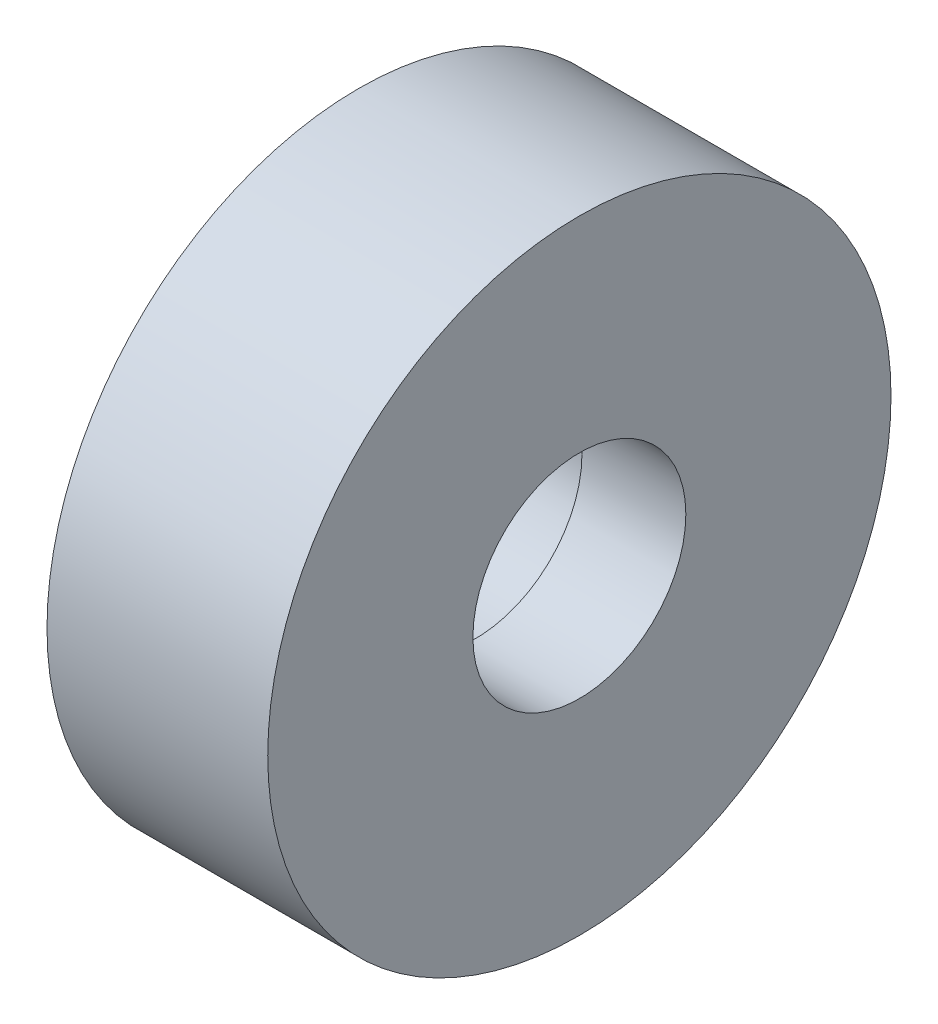
ISO-10303-21;
HEADER;
FILE_DESCRIPTION(('STEP AP214'),'2;1');
FILE_NAME('part.step','',(''),(''),'','','');
FILE_SCHEMA(('AUTOMOTIVE_DESIGN { 1 0 10303 214 1 1 1 1 }'));
ENDSEC;
DATA;
#1=APPLICATION_CONTEXT('core data for automotive mechanical design processes');
#2=APPLICATION_PROTOCOL_DEFINITION('international standard','automotive_design',2000,#1);
#3=PRODUCT_CONTEXT('',#1,'mechanical');
#4=PRODUCT('Part','Part','',(#3));
#5=PRODUCT_RELATED_PRODUCT_CATEGORY('part','',(#4));
#6=PRODUCT_DEFINITION_FORMATION('','',#4);
#7=PRODUCT_DEFINITION_CONTEXT('part definition',#1,'design');
#8=PRODUCT_DEFINITION('design','',#6,#7);
#9=PRODUCT_DEFINITION_SHAPE('','',#8);
#10=(LENGTH_UNIT() NAMED_UNIT(*) SI_UNIT(.MILLI.,.METRE.));
#11=(NAMED_UNIT(*) PLANE_ANGLE_UNIT() SI_UNIT($,.RADIAN.));
#12=(NAMED_UNIT(*) SI_UNIT($,.STERADIAN.) SOLID_ANGLE_UNIT());
#13=UNCERTAINTY_MEASURE_WITH_UNIT(LENGTH_MEASURE(1.E-05),#10,'distance_accuracy_value','');
#14=(GEOMETRIC_REPRESENTATION_CONTEXT(3) GLOBAL_UNCERTAINTY_ASSIGNED_CONTEXT((#13)) GLOBAL_UNIT_ASSIGNED_CONTEXT((#10,
#11,#12)) REPRESENTATION_CONTEXT('',''));
#15=CARTESIAN_POINT('',(0.,0.,0.));
#16=DIRECTION('',(0.,0.,1.));
#17=DIRECTION('',(1.,0.,0.));
#18=AXIS2_PLACEMENT_3D('',#15,#16,#17);
#19=CARTESIAN_POINT('',(4.25,4.1,0.));
#20=DIRECTION('',(-1.,0.,0.));
#21=DIRECTION('',(0.,0.,1.));
#22=AXIS2_PLACEMENT_3D('',#19,#20,#21);
#23=PLANE('',#22);
#24=CARTESIAN_POINT('',(4.25,0.,0.));
#25=DIRECTION('',(-1.,0.,0.));
#26=DIRECTION('',(0.,0.,1.));
#27=AXIS2_PLACEMENT_3D('',#24,#25,#26);
#28=CIRCLE('',#27,12.);
#29=CARTESIAN_POINT('',(4.25,0.,12.));
#30=VERTEX_POINT('',#29);
#31=EDGE_CURVE('E54',#30,#30,#28,.T.);
#32=ORIENTED_EDGE('',*,*,#31,.F.);
#33=EDGE_LOOP('',(#32));
#34=FACE_BOUND('',#33,.T.);
#35=CARTESIAN_POINT('',(4.25,0.,0.));
#36=DIRECTION('',(-1.,0.,0.));
#37=DIRECTION('',(0.,0.,1.));
#38=AXIS2_PLACEMENT_3D('',#35,#36,#37);
#39=CIRCLE('',#38,4.1);
#40=CARTESIAN_POINT('',(4.25,0.,4.1));
#41=VERTEX_POINT('',#40);
#42=EDGE_CURVE('E10',#41,#41,#39,.T.);
#43=ORIENTED_EDGE('',*,*,#42,.T.);
#44=EDGE_LOOP('',(#43));
#45=FACE_BOUND('',#44,.T.);
#46=ADVANCED_FACE('F32',(#34,#45),#23,.F.);
#47=CARTESIAN_POINT('',(0.,0.,0.));
#48=DIRECTION('',(-1.,0.,0.));
#49=DIRECTION('',(0.,0.,1.));
#50=AXIS2_PLACEMENT_3D('',#47,#48,#49);
#51=CYLINDRICAL_SURFACE('',#50,4.1);
#52=ORIENTED_EDGE('',*,*,#42,.F.);
#53=EDGE_LOOP('',(#52));
#54=FACE_BOUND('',#53,.T.);
#55=CARTESIAN_POINT('',(0.25,0.,0.));
#56=DIRECTION('',(-1.,0.,0.));
#57=DIRECTION('',(0.,0.,1.));
#58=AXIS2_PLACEMENT_3D('',#55,#56,#57);
#59=CIRCLE('',#58,4.1);
#60=CARTESIAN_POINT('',(0.25,0.,4.1));
#61=VERTEX_POINT('',#60);
#62=EDGE_CURVE('E38',#61,#61,#59,.T.);
#63=ORIENTED_EDGE('',*,*,#62,.T.);
#64=EDGE_LOOP('',(#63));
#65=FACE_BOUND('',#64,.T.);
#66=ADVANCED_FACE('F61',(#54,#65),#51,.F.);
#67=CARTESIAN_POINT('',(0.25,4.15,0.));
#68=DIRECTION('',(1.,0.,0.));
#69=DIRECTION('',(0.,0.,-1.));
#70=AXIS2_PLACEMENT_3D('',#67,#68,#69);
#71=PLANE('',#70);
#72=ORIENTED_EDGE('',*,*,#62,.F.);
#73=EDGE_LOOP('',(#72));
#74=FACE_BOUND('',#73,.T.);
#75=CARTESIAN_POINT('',(0.25,0.,0.));
#76=DIRECTION('',(-1.,0.,0.));
#77=DIRECTION('',(0.,0.,1.));
#78=AXIS2_PLACEMENT_3D('',#75,#76,#77);
#79=CIRCLE('',#78,4.15);
#80=CARTESIAN_POINT('',(0.25,0.,4.15));
#81=VERTEX_POINT('',#80);
#82=EDGE_CURVE('E42',#81,#81,#79,.T.);
#83=ORIENTED_EDGE('',*,*,#82,.T.);
#84=EDGE_LOOP('',(#83));
#85=FACE_BOUND('',#84,.T.);
#86=ADVANCED_FACE('F65',(#74,#85),#71,.F.);
#87=CARTESIAN_POINT('',(0.,0.,0.));
#88=DIRECTION('',(-1.,0.,0.));
#89=DIRECTION('',(0.,0.,1.));
#90=AXIS2_PLACEMENT_3D('',#87,#88,#89);
#91=CYLINDRICAL_SURFACE('',#90,4.15);
#92=ORIENTED_EDGE('',*,*,#82,.F.);
#93=EDGE_LOOP('',(#92));
#94=FACE_BOUND('',#93,.T.);
#95=CARTESIAN_POINT('',(-4.25,0.,0.));
#96=DIRECTION('',(-1.,0.,0.));
#97=DIRECTION('',(0.,0.,1.));
#98=AXIS2_PLACEMENT_3D('',#95,#96,#97);
#99=CIRCLE('',#98,4.15);
#100=CARTESIAN_POINT('',(-4.25,0.,4.15));
#101=VERTEX_POINT('',#100);
#102=EDGE_CURVE('E46',#101,#101,#99,.T.);
#103=ORIENTED_EDGE('',*,*,#102,.T.);
#104=EDGE_LOOP('',(#103));
#105=FACE_BOUND('',#104,.T.);
#106=ADVANCED_FACE('F70',(#94,#105),#91,.F.);
#107=CARTESIAN_POINT('',(-4.25,12.,0.));
#108=DIRECTION('',(1.,0.,0.));
#109=DIRECTION('',(0.,0.,-1.));
#110=AXIS2_PLACEMENT_3D('',#107,#108,#109);
#111=PLANE('',#110);
#112=ORIENTED_EDGE('',*,*,#102,.F.);
#113=EDGE_LOOP('',(#112));
#114=FACE_BOUND('',#113,.T.);
#115=CARTESIAN_POINT('',(-4.25,0.,0.));
#116=DIRECTION('',(-1.,0.,0.));
#117=DIRECTION('',(0.,0.,1.));
#118=AXIS2_PLACEMENT_3D('',#115,#116,#117);
#119=CIRCLE('',#118,12.);
#120=CARTESIAN_POINT('',(-4.25,0.,12.));
#121=VERTEX_POINT('',#120);
#122=EDGE_CURVE('E51',#121,#121,#119,.T.);
#123=ORIENTED_EDGE('',*,*,#122,.T.);
#124=EDGE_LOOP('',(#123));
#125=FACE_BOUND('',#124,.T.);
#126=ADVANCED_FACE('F76',(#114,#125),#111,.F.);
#127=CARTESIAN_POINT('',(0.,0.,0.));
#128=DIRECTION('',(-1.,0.,0.));
#129=DIRECTION('',(0.,0.,1.));
#130=AXIS2_PLACEMENT_3D('',#127,#128,#129);
#131=CYLINDRICAL_SURFACE('',#130,12.);
#132=ORIENTED_EDGE('',*,*,#122,.F.);
#133=EDGE_LOOP('',(#132));
#134=FACE_BOUND('',#133,.T.);
#135=ORIENTED_EDGE('',*,*,#31,.T.);
#136=EDGE_LOOP('',(#135));
#137=FACE_BOUND('',#136,.T.);
#138=ADVANCED_FACE('F58',(#134,#137),#131,.T.);
#139=CLOSED_SHELL('',(#46,#66,#86,#106,#126,#138));
#140=MANIFOLD_SOLID_BREP('B2',#139);
#141=ADVANCED_BREP_SHAPE_REPRESENTATION('',(#18,#140),#14);
#142=SHAPE_DEFINITION_REPRESENTATION(#9,#141);
ENDSEC;
END-ISO-10303-21;
